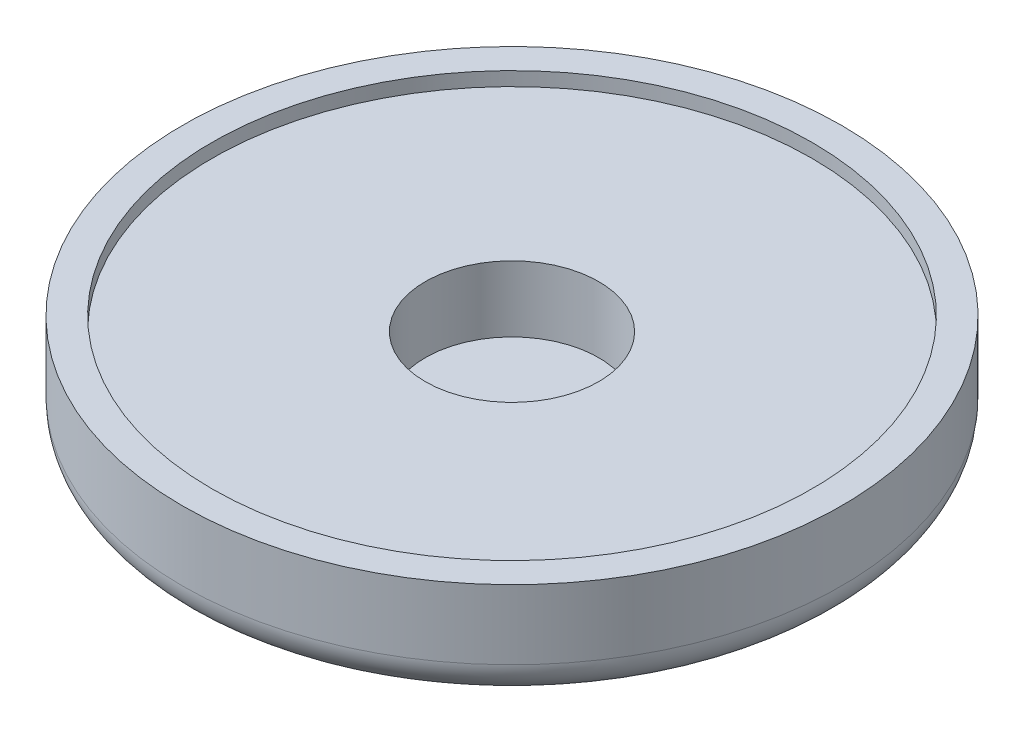
ISO-10303-21;
HEADER;
FILE_DESCRIPTION(('STEP AP214'),'2;1');
FILE_NAME('part.step','',(''),(''),'','','');
FILE_SCHEMA(('AUTOMOTIVE_DESIGN { 1 0 10303 214 1 1 1 1 }'));
ENDSEC;
DATA;
#1=APPLICATION_CONTEXT('core data for automotive mechanical design processes');
#2=APPLICATION_PROTOCOL_DEFINITION('international standard','automotive_design',2000,#1);
#3=PRODUCT_CONTEXT('',#1,'mechanical');
#4=PRODUCT('Part','Part','',(#3));
#5=PRODUCT_RELATED_PRODUCT_CATEGORY('part','',(#4));
#6=PRODUCT_DEFINITION_FORMATION('','',#4);
#7=PRODUCT_DEFINITION_CONTEXT('part definition',#1,'design');
#8=PRODUCT_DEFINITION('design','',#6,#7);
#9=PRODUCT_DEFINITION_SHAPE('','',#8);
#10=(LENGTH_UNIT() NAMED_UNIT(*) SI_UNIT(.MILLI.,.METRE.));
#11=(NAMED_UNIT(*) PLANE_ANGLE_UNIT() SI_UNIT($,.RADIAN.));
#12=(NAMED_UNIT(*) SI_UNIT($,.STERADIAN.) SOLID_ANGLE_UNIT());
#13=UNCERTAINTY_MEASURE_WITH_UNIT(LENGTH_MEASURE(1.E-05),#10,'distance_accuracy_value','');
#14=(GEOMETRIC_REPRESENTATION_CONTEXT(3) GLOBAL_UNCERTAINTY_ASSIGNED_CONTEXT((#13)) GLOBAL_UNIT_ASSIGNED_CONTEXT((#10,
#11,#12)) REPRESENTATION_CONTEXT('',''));
#15=CARTESIAN_POINT('',(0.,0.,0.));
#16=DIRECTION('',(0.,0.,1.));
#17=DIRECTION('',(1.,0.,0.));
#18=AXIS2_PLACEMENT_3D('',#15,#16,#17);
#19=CARTESIAN_POINT('',(0.,7.62,0.));
#20=DIRECTION('',(0.,-1.,0.));
#21=DIRECTION('',(0.,0.,-1.));
#22=AXIS2_PLACEMENT_3D('',#19,#20,#21);
#23=CYLINDRICAL_SURFACE('',#22,24.13);
#24=CARTESIAN_POINT('',(0.,2.54,0.));
#25=DIRECTION('',(0.,1.,0.));
#26=DIRECTION('',(0.,0.,1.));
#27=AXIS2_PLACEMENT_3D('',#24,#25,#26);
#28=CIRCLE('',#27,24.13);
#29=CARTESIAN_POINT('',(0.,2.54,-24.13));
#30=VERTEX_POINT('',#29);
#31=EDGE_CURVE('E45',#30,#30,#28,.T.);
#32=CARTESIAN_POINT('',(0.,7.62,0.));
#33=DIRECTION('',(0.,1.,0.));
#34=DIRECTION('',(0.,0.,1.));
#35=AXIS2_PLACEMENT_3D('',#32,#33,#34);
#36=CIRCLE('',#35,24.13);
#37=CARTESIAN_POINT('',(0.,7.62,-24.13));
#38=VERTEX_POINT('',#37);
#39=EDGE_CURVE('E50',#38,#38,#36,.T.);
#40=CARTESIAN_POINT('',(0.,2.54,-24.13));
#41=CARTESIAN_POINT('',(0.,2.59291666666667,-24.13));
#42=CARTESIAN_POINT('',(0.,2.64583333333333,-24.13));
#43=CARTESIAN_POINT('',(0.,2.75166666666667,-24.13));
#44=CARTESIAN_POINT('',(0.,2.80458333333333,-24.13));
#45=CARTESIAN_POINT('',(0.,2.91041666666667,-24.13));
#46=CARTESIAN_POINT('',(0.,2.96333333333333,-24.13));
#47=CARTESIAN_POINT('',(0.,3.06916666666667,-24.13));
#48=CARTESIAN_POINT('',(0.,3.12208333333333,-24.13));
#49=CARTESIAN_POINT('',(0.,3.22791666666667,-24.13));
#50=CARTESIAN_POINT('',(0.,3.28083333333333,-24.13));
#51=CARTESIAN_POINT('',(0.,3.38666666666667,-24.13));
#52=CARTESIAN_POINT('',(0.,3.43958333333333,-24.13));
#53=CARTESIAN_POINT('',(0.,3.54541666666667,-24.13));
#54=CARTESIAN_POINT('',(0.,3.59833333333333,-24.13));
#55=CARTESIAN_POINT('',(0.,3.70416666666667,-24.13));
#56=CARTESIAN_POINT('',(0.,3.75708333333333,-24.13));
#57=CARTESIAN_POINT('',(0.,3.86291666666667,-24.13));
#58=CARTESIAN_POINT('',(0.,3.91583333333333,-24.13));
#59=CARTESIAN_POINT('',(0.,4.02166666666667,-24.13));
#60=CARTESIAN_POINT('',(0.,4.07458333333333,-24.13));
#61=CARTESIAN_POINT('',(0.,4.18041666666667,-24.13));
#62=CARTESIAN_POINT('',(0.,4.23333333333333,-24.13));
#63=CARTESIAN_POINT('',(0.,4.33916666666666,-24.13));
#64=CARTESIAN_POINT('',(0.,4.39208333333333,-24.13));
#65=CARTESIAN_POINT('',(0.,4.49791666666667,-24.13));
#66=CARTESIAN_POINT('',(0.,4.55083333333333,-24.13));
#67=CARTESIAN_POINT('',(0.,4.65666666666666,-24.13));
#68=CARTESIAN_POINT('',(0.,4.70958333333333,-24.13));
#69=CARTESIAN_POINT('',(0.,4.81541666666666,-24.13));
#70=CARTESIAN_POINT('',(0.,4.86833333333333,-24.13));
#71=CARTESIAN_POINT('',(0.,4.97416666666667,-24.13));
#72=CARTESIAN_POINT('',(0.,5.02708333333333,-24.13));
#73=CARTESIAN_POINT('',(0.,5.13291666666666,-24.13));
#74=CARTESIAN_POINT('',(0.,5.18583333333333,-24.13));
#75=CARTESIAN_POINT('',(0.,5.29166666666667,-24.13));
#76=CARTESIAN_POINT('',(0.,5.34458333333333,-24.13));
#77=CARTESIAN_POINT('',(0.,5.45041666666666,-24.13));
#78=CARTESIAN_POINT('',(0.,5.50333333333333,-24.13));
#79=CARTESIAN_POINT('',(0.,5.60916666666667,-24.13));
#80=CARTESIAN_POINT('',(0.,5.66208333333333,-24.13));
#81=CARTESIAN_POINT('',(0.,5.76791666666667,-24.13));
#82=CARTESIAN_POINT('',(0.,5.82083333333333,-24.13));
#83=CARTESIAN_POINT('',(0.,5.92666666666666,-24.13));
#84=CARTESIAN_POINT('',(0.,5.97958333333333,-24.13));
#85=CARTESIAN_POINT('',(0.,6.08541666666667,-24.13));
#86=CARTESIAN_POINT('',(0.,6.13833333333333,-24.13));
#87=CARTESIAN_POINT('',(0.,6.24416666666666,-24.13));
#88=CARTESIAN_POINT('',(0.,6.29708333333333,-24.13));
#89=CARTESIAN_POINT('',(0.,6.40291666666666,-24.13));
#90=CARTESIAN_POINT('',(0.,6.45583333333333,-24.13));
#91=CARTESIAN_POINT('',(0.,6.56166666666666,-24.13));
#92=CARTESIAN_POINT('',(0.,6.61458333333333,-24.13));
#93=CARTESIAN_POINT('',(0.,6.72041666666666,-24.13));
#94=CARTESIAN_POINT('',(0.,6.77333333333333,-24.13));
#95=CARTESIAN_POINT('',(0.,6.87916666666666,-24.13));
#96=CARTESIAN_POINT('',(0.,6.93208333333333,-24.13));
#97=CARTESIAN_POINT('',(0.,7.03791666666666,-24.13));
#98=CARTESIAN_POINT('',(0.,7.09083333333333,-24.13));
#99=CARTESIAN_POINT('',(0.,7.19666666666666,-24.13));
#100=CARTESIAN_POINT('',(0.,7.24958333333333,-24.13));
#101=CARTESIAN_POINT('',(0.,7.35541666666666,-24.13));
#102=CARTESIAN_POINT('',(0.,7.40833333333333,-24.13));
#103=CARTESIAN_POINT('',(0.,7.51416666666666,-24.13));
#104=CARTESIAN_POINT('',(0.,7.56708333333333,-24.13));
#105=CARTESIAN_POINT('',(0.,7.62,-24.13));
#106=B_SPLINE_CURVE_WITH_KNOTS('',3,(#40,#41,#42,#43,#44,#45,#46,#47,#48,#49,#50,#51,#52,#53,
#54,#55,#56,#57,#58,#59,#60,#61,#62,#63,#64,#65,#66,#67,#68,#69,#70,#71,#72,#73,#74,#75,#76,#77,
#78,#79,#80,#81,#82,#83,#84,#85,#86,#87,#88,#89,#90,#91,#92,#93,#94,#95,#96,#97,#98,#99,#100,
#101,#102,#103,#104,#105),.UNSPECIFIED.,.F.,.F.,(4,2,2,2,2,2,2,2,2,2,2,2,2,2,2,2,2,2,2,2,2,2,2,
2,2,2,2,2,2,2,2,2,4),(0.,0.15875,0.3175,0.47625,0.635,0.79375,0.9525,1.11125,1.27,1.42875,
1.5875,1.74625,1.905,2.06375,2.2225,2.38125,2.54,2.69875,2.8575,3.01625,3.175,3.33375,3.4925,
3.65125,3.81,3.96875,4.1275,4.28625,4.445,4.60375,4.7625,4.92125,5.08),.UNSPECIFIED.);
#107=EDGE_CURVE('BSEAM37',#30,#38,#106,.T.);
#108=ORIENTED_EDGE('',*,*,#31,.T.);
#109=ORIENTED_EDGE('',*,*,#39,.F.);
#110=ORIENTED_EDGE('',*,*,#107,.T.);
#111=ORIENTED_EDGE('',*,*,#107,.F.);
#112=EDGE_LOOP('',(#108,#110,#109,#111));
#113=FACE_BOUND('',#112,.T.);
#114=ADVANCED_FACE('F37',(#113),#23,.T.);
#115=CARTESIAN_POINT('',(0.,7.62,0.));
#116=DIRECTION('',(0.,1.,0.));
#117=DIRECTION('',(0.,0.,1.));
#118=AXIS2_PLACEMENT_3D('',#115,#116,#117);
#119=PLANE('',#118);
#120=CARTESIAN_POINT('',(0.,7.62,0.));
#121=DIRECTION('',(0.,1.,0.));
#122=DIRECTION('',(0.,0.,1.));
#123=AXIS2_PLACEMENT_3D('',#120,#121,#122);
#124=CIRCLE('',#123,21.971);
#125=CARTESIAN_POINT('',(0.,7.62,21.971));
#126=VERTEX_POINT('',#125);
#127=EDGE_CURVE('E58',#126,#126,#124,.T.);
#128=ORIENTED_EDGE('',*,*,#127,.F.);
#129=EDGE_LOOP('',(#128));
#130=FACE_BOUND('',#129,.T.);
#131=ORIENTED_EDGE('',*,*,#39,.T.);
#132=EDGE_LOOP('',(#131));
#133=FACE_BOUND('',#132,.T.);
#134=ADVANCED_FACE('F95',(#130,#133),#119,.T.);
#135=CARTESIAN_POINT('',(0.,0.,0.));
#136=DIRECTION('',(0.,1.,0.));
#137=DIRECTION('',(0.,0.,1.));
#138=AXIS2_PLACEMENT_3D('',#135,#136,#137);
#139=PLANE('',#138);
#140=CARTESIAN_POINT('',(0.,0.,0.));
#141=DIRECTION('',(0.,1.,0.));
#142=DIRECTION('',(0.,0.,1.));
#143=AXIS2_PLACEMENT_3D('',#140,#141,#142);
#144=CIRCLE('',#143,21.59);
#145=CARTESIAN_POINT('',(0.,0.,21.59));
#146=VERTEX_POINT('',#145);
#147=EDGE_CURVE('E10',#146,#146,#144,.F.);
#148=ORIENTED_EDGE('',*,*,#147,.T.);
#149=EDGE_LOOP('',(#148));
#150=FACE_BOUND('',#149,.T.);
#151=ADVANCED_FACE('F91',(#150),#139,.F.);
#152=CARTESIAN_POINT('',(0.,6.604,0.));
#153=DIRECTION('',(0.,1.,0.));
#154=DIRECTION('',(0.,0.,1.));
#155=AXIS2_PLACEMENT_3D('',#152,#153,#154);
#156=CYLINDRICAL_SURFACE('',#155,21.971);
#157=CARTESIAN_POINT('',(0.,6.604,0.));
#158=DIRECTION('',(0.,1.,0.));
#159=DIRECTION('',(0.,0.,1.));
#160=AXIS2_PLACEMENT_3D('',#157,#158,#159);
#161=CIRCLE('',#160,21.971);
#162=CARTESIAN_POINT('',(0.,6.604,21.971));
#163=VERTEX_POINT('',#162);
#164=EDGE_CURVE('E55',#163,#163,#161,.T.);
#165=ORIENTED_EDGE('',*,*,#164,.F.);
#166=EDGE_LOOP('',(#165));
#167=FACE_BOUND('',#166,.T.);
#168=ORIENTED_EDGE('',*,*,#127,.T.);
#169=EDGE_LOOP('',(#168));
#170=FACE_BOUND('',#169,.T.);
#171=ADVANCED_FACE('F85',(#167,#170),#156,.F.);
#172=CARTESIAN_POINT('',(0.,6.604,0.));
#173=DIRECTION('',(0.,1.,0.));
#174=DIRECTION('',(0.,0.,1.));
#175=AXIS2_PLACEMENT_3D('',#172,#173,#174);
#176=PLANE('',#175);
#177=CARTESIAN_POINT('',(0.,6.604,0.));
#178=DIRECTION('',(0.,1.,0.));
#179=DIRECTION('',(0.,0.,1.));
#180=AXIS2_PLACEMENT_3D('',#177,#178,#179);
#181=CIRCLE('',#180,6.35);
#182=CARTESIAN_POINT('',(0.,6.604,6.35));
#183=VERTEX_POINT('',#182);
#184=EDGE_CURVE('E66',#183,#183,#181,.T.);
#185=ORIENTED_EDGE('',*,*,#184,.F.);
#186=EDGE_LOOP('',(#185));
#187=FACE_BOUND('',#186,.T.);
#188=ORIENTED_EDGE('',*,*,#164,.T.);
#189=EDGE_LOOP('',(#188));
#190=FACE_BOUND('',#189,.T.);
#191=ADVANCED_FACE('F79',(#187,#190),#176,.T.);
#192=CARTESIAN_POINT('',(0.,1.778,0.));
#193=DIRECTION('',(0.,1.,0.));
#194=DIRECTION('',(0.,0.,1.));
#195=AXIS2_PLACEMENT_3D('',#192,#193,#194);
#196=CYLINDRICAL_SURFACE('',#195,6.35);
#197=CARTESIAN_POINT('',(0.,1.778,0.));
#198=DIRECTION('',(0.,1.,0.));
#199=DIRECTION('',(0.,0.,1.));
#200=AXIS2_PLACEMENT_3D('',#197,#198,#199);
#201=CIRCLE('',#200,6.35);
#202=CARTESIAN_POINT('',(0.,1.778,6.35));
#203=VERTEX_POINT('',#202);
#204=EDGE_CURVE('E62',#203,#203,#201,.T.);
#205=ORIENTED_EDGE('',*,*,#204,.F.);
#206=EDGE_LOOP('',(#205));
#207=FACE_BOUND('',#206,.T.);
#208=ORIENTED_EDGE('',*,*,#184,.T.);
#209=EDGE_LOOP('',(#208));
#210=FACE_BOUND('',#209,.T.);
#211=ADVANCED_FACE('F76',(#207,#210),#196,.F.);
#212=CARTESIAN_POINT('',(0.,1.778,0.));
#213=DIRECTION('',(0.,1.,0.));
#214=DIRECTION('',(0.,0.,1.));
#215=AXIS2_PLACEMENT_3D('',#212,#213,#214);
#216=PLANE('',#215);
#217=ORIENTED_EDGE('',*,*,#204,.T.);
#218=EDGE_LOOP('',(#217));
#219=FACE_BOUND('',#218,.T.);
#220=ADVANCED_FACE('F74',(#219),#216,.T.);
#221=CARTESIAN_POINT('',(0.,2.54,0.));
#222=DIRECTION('',(0.,1.,0.));
#223=DIRECTION('',(0.,0.,1.));
#224=AXIS2_PLACEMENT_3D('',#221,#222,#223);
#225=TOROIDAL_SURFACE('',#224,21.59,2.54);
#226=ORIENTED_EDGE('',*,*,#147,.F.);
#227=EDGE_LOOP('',(#226));
#228=FACE_BOUND('',#227,.T.);
#229=ORIENTED_EDGE('',*,*,#31,.F.);
#230=EDGE_LOOP('',(#229));
#231=FACE_BOUND('',#230,.T.);
#232=ADVANCED_FACE('F39',(#228,#231),#225,.T.);
#233=CLOSED_SHELL('',(#114,#134,#151,#171,#191,#211,#220,#232));
#234=MANIFOLD_SOLID_BREP('B2',#233);
#235=ADVANCED_BREP_SHAPE_REPRESENTATION('',(#18,#234),#14);
#236=SHAPE_DEFINITION_REPRESENTATION(#9,#235);
ENDSEC;
END-ISO-10303-21;
